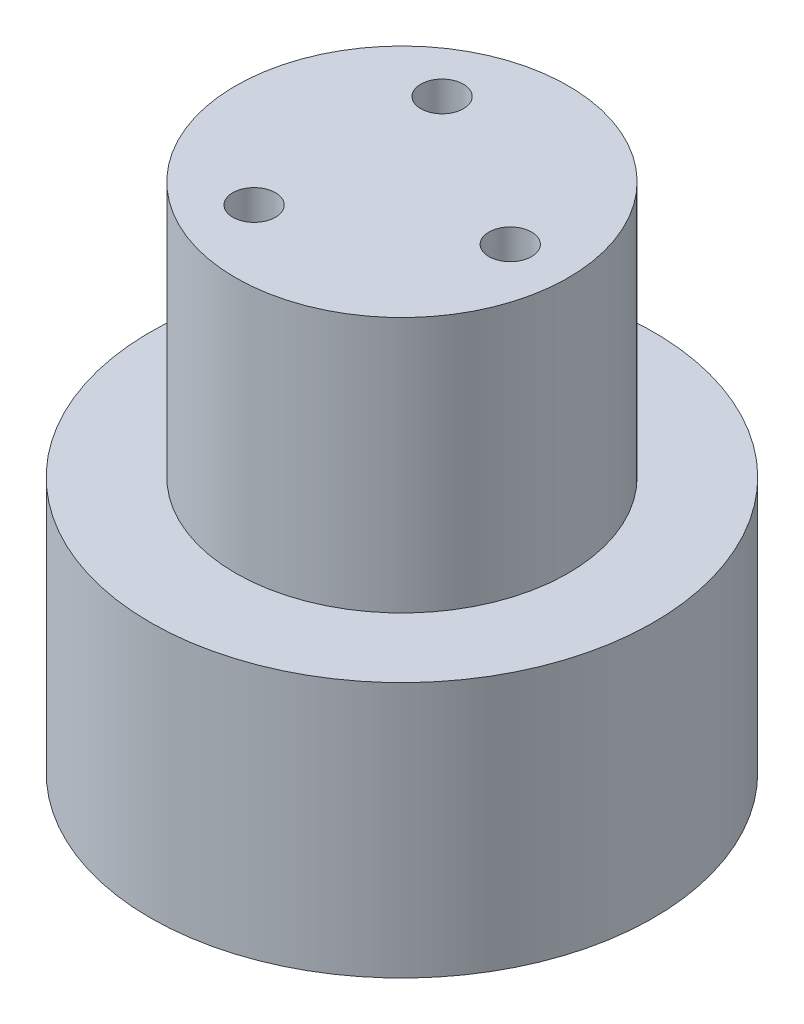
ISO-10303-21;
HEADER;
FILE_DESCRIPTION(('STEP AP214'),'2;1');
FILE_NAME('part.step','',(''),(''),'','','');
FILE_SCHEMA(('AUTOMOTIVE_DESIGN { 1 0 10303 214 1 1 1 1 }'));
ENDSEC;
DATA;
#1=APPLICATION_CONTEXT('core data for automotive mechanical design processes');
#2=APPLICATION_PROTOCOL_DEFINITION('international standard','automotive_design',2000,#1);
#3=PRODUCT_CONTEXT('',#1,'mechanical');
#4=PRODUCT('Part','Part','',(#3));
#5=PRODUCT_RELATED_PRODUCT_CATEGORY('part','',(#4));
#6=PRODUCT_DEFINITION_FORMATION('','',#4);
#7=PRODUCT_DEFINITION_CONTEXT('part definition',#1,'design');
#8=PRODUCT_DEFINITION('design','',#6,#7);
#9=PRODUCT_DEFINITION_SHAPE('','',#8);
#10=(LENGTH_UNIT() NAMED_UNIT(*) SI_UNIT(.MILLI.,.METRE.));
#11=(NAMED_UNIT(*) PLANE_ANGLE_UNIT() SI_UNIT($,.RADIAN.));
#12=(NAMED_UNIT(*) SI_UNIT($,.STERADIAN.) SOLID_ANGLE_UNIT());
#13=UNCERTAINTY_MEASURE_WITH_UNIT(LENGTH_MEASURE(1.E-05),#10,'distance_accuracy_value','');
#14=(GEOMETRIC_REPRESENTATION_CONTEXT(3) GLOBAL_UNCERTAINTY_ASSIGNED_CONTEXT((#13)) GLOBAL_UNIT_ASSIGNED_CONTEXT((#10,
#11,#12)) REPRESENTATION_CONTEXT('',''));
#15=CARTESIAN_POINT('',(0.,0.,0.));
#16=DIRECTION('',(0.,0.,1.));
#17=DIRECTION('',(1.,0.,0.));
#18=AXIS2_PLACEMENT_3D('',#15,#16,#17);
#19=CARTESIAN_POINT('',(0.,-3.,0.));
#20=DIRECTION('',(0.,1.,0.));
#21=DIRECTION('',(0.,0.,1.));
#22=AXIS2_PLACEMENT_3D('',#19,#20,#21);
#23=CYLINDRICAL_SURFACE('',#22,2.95);
#24=CARTESIAN_POINT('',(0.,-3.,0.));
#25=DIRECTION('',(0.,1.,0.));
#26=DIRECTION('',(0.,0.,1.));
#27=AXIS2_PLACEMENT_3D('',#24,#25,#26);
#28=CIRCLE('',#27,2.95);
#29=CARTESIAN_POINT('',(0.,-3.,2.95));
#30=VERTEX_POINT('',#29);
#31=EDGE_CURVE('E40',#30,#30,#28,.T.);
#32=ORIENTED_EDGE('',*,*,#31,.T.);
#33=EDGE_LOOP('',(#32));
#34=FACE_BOUND('',#33,.T.);
#35=CARTESIAN_POINT('',(0.,0.,0.));
#36=DIRECTION('',(0.,1.,0.));
#37=DIRECTION('',(0.,0.,1.));
#38=AXIS2_PLACEMENT_3D('',#35,#36,#37);
#39=CIRCLE('',#38,2.95);
#40=CARTESIAN_POINT('',(0.,0.,2.95));
#41=VERTEX_POINT('',#40);
#42=EDGE_CURVE('E36',#41,#41,#39,.T.);
#43=ORIENTED_EDGE('',*,*,#42,.F.);
#44=EDGE_LOOP('',(#43));
#45=FACE_BOUND('',#44,.T.);
#46=ADVANCED_FACE('F33',(#34,#45),#23,.T.);
#47=CARTESIAN_POINT('',(0.,-3.,0.));
#48=DIRECTION('',(0.,1.,0.));
#49=DIRECTION('',(0.,0.,1.));
#50=AXIS2_PLACEMENT_3D('',#47,#48,#49);
#51=PLANE('',#50);
#52=CARTESIAN_POINT('',(1.27000000000006,-3.,0.));
#53=DIRECTION('',(0.,-1.,0.));
#54=DIRECTION('',(0.,0.,-1.));
#55=AXIS2_PLACEMENT_3D('',#52,#53,#54);
#56=CIRCLE('',#55,0.250000000000013);
#57=CARTESIAN_POINT('',(1.27000000000006,-3.,-0.249999999999999));
#58=VERTEX_POINT('',#57);
#59=EDGE_CURVE('E62',#58,#58,#56,.T.);
#60=ORIENTED_EDGE('',*,*,#59,.F.);
#61=EDGE_LOOP('',(#60));
#62=FACE_BOUND('',#61,.T.);
#63=CARTESIAN_POINT('',(-0.630957819255,-3.,1.10217613398265));
#64=DIRECTION('',(0.,-1.,0.));
#65=DIRECTION('',(0.,0.,-1.));
#66=AXIS2_PLACEMENT_3D('',#63,#64,#65);
#67=CIRCLE('',#66,0.250000000000013);
#68=CARTESIAN_POINT('',(-0.630957819255,-3.,0.852176133982633));
#69=VERTEX_POINT('',#68);
#70=EDGE_CURVE('E56',#69,#69,#67,.T.);
#71=ORIENTED_EDGE('',*,*,#70,.F.);
#72=EDGE_LOOP('',(#71));
#73=FACE_BOUND('',#72,.T.);
#74=CARTESIAN_POINT('',(-0.630957819255001,-3.,-1.10217613398262));
#75=DIRECTION('',(0.,-1.,0.));
#76=DIRECTION('',(0.,0.,-1.));
#77=AXIS2_PLACEMENT_3D('',#74,#75,#76);
#78=CIRCLE('',#77,0.250000000000013);
#79=CARTESIAN_POINT('',(-0.630957819255001,-3.,-1.35217613398263));
#80=VERTEX_POINT('',#79);
#81=EDGE_CURVE('E50',#80,#80,#78,.T.);
#82=ORIENTED_EDGE('',*,*,#81,.F.);
#83=EDGE_LOOP('',(#82));
#84=FACE_BOUND('',#83,.T.);
#85=ORIENTED_EDGE('',*,*,#31,.F.);
#86=EDGE_LOOP('',(#85));
#87=FACE_BOUND('',#86,.T.);
#88=ADVANCED_FACE('F78',(#62,#73,#84,#87),#51,.F.);
#89=CARTESIAN_POINT('',(0.,0.,0.));
#90=DIRECTION('',(0.,1.,0.));
#91=DIRECTION('',(0.,0.,1.));
#92=AXIS2_PLACEMENT_3D('',#89,#90,#91);
#93=PLANE('',#92);
#94=CARTESIAN_POINT('',(0.,0.,0.));
#95=DIRECTION('',(0.,1.,0.));
#96=DIRECTION('',(0.,0.,1.));
#97=AXIS2_PLACEMENT_3D('',#94,#95,#96);
#98=CIRCLE('',#97,1.95);
#99=CARTESIAN_POINT('',(0.,0.,1.95));
#100=VERTEX_POINT('',#99);
#101=EDGE_CURVE('E10',#100,#100,#98,.T.);
#102=ORIENTED_EDGE('',*,*,#101,.F.);
#103=EDGE_LOOP('',(#102));
#104=FACE_BOUND('',#103,.T.);
#105=ORIENTED_EDGE('',*,*,#42,.T.);
#106=EDGE_LOOP('',(#105));
#107=FACE_BOUND('',#106,.T.);
#108=ADVANCED_FACE('F81',(#104,#107),#93,.T.);
#109=CARTESIAN_POINT('',(0.,3.,0.));
#110=DIRECTION('',(0.,-1.,0.));
#111=DIRECTION('',(0.,0.,-1.));
#112=AXIS2_PLACEMENT_3D('',#109,#110,#111);
#113=CYLINDRICAL_SURFACE('',#112,1.95);
#114=CARTESIAN_POINT('',(0.,3.,0.));
#115=DIRECTION('',(0.,1.,0.));
#116=DIRECTION('',(0.,0.,1.));
#117=AXIS2_PLACEMENT_3D('',#114,#115,#116);
#118=CIRCLE('',#117,1.95);
#119=CARTESIAN_POINT('',(0.,3.,1.95));
#120=VERTEX_POINT('',#119);
#121=EDGE_CURVE('E46',#120,#120,#118,.T.);
#122=ORIENTED_EDGE('',*,*,#121,.F.);
#123=EDGE_LOOP('',(#122));
#124=FACE_BOUND('',#123,.T.);
#125=ORIENTED_EDGE('',*,*,#101,.T.);
#126=EDGE_LOOP('',(#125));
#127=FACE_BOUND('',#126,.T.);
#128=ADVANCED_FACE('F95',(#124,#127),#113,.T.);
#129=CARTESIAN_POINT('',(0.,3.,0.));
#130=DIRECTION('',(0.,1.,0.));
#131=DIRECTION('',(0.,0.,1.));
#132=AXIS2_PLACEMENT_3D('',#129,#130,#131);
#133=PLANE('',#132);
#134=CARTESIAN_POINT('',(1.27000000000006,3.,0.));
#135=DIRECTION('',(0.,-1.,0.));
#136=DIRECTION('',(0.,0.,-1.));
#137=AXIS2_PLACEMENT_3D('',#134,#135,#136);
#138=CIRCLE('',#137,0.250000000000013);
#139=CARTESIAN_POINT('',(1.27000000000006,3.,-0.249999999999999));
#140=VERTEX_POINT('',#139);
#141=EDGE_CURVE('E49',#140,#140,#138,.T.);
#142=ORIENTED_EDGE('',*,*,#141,.T.);
#143=EDGE_LOOP('',(#142));
#144=FACE_BOUND('',#143,.T.);
#145=CARTESIAN_POINT('',(-0.630957819255,3.,1.10217613398265));
#146=DIRECTION('',(0.,-1.,0.));
#147=DIRECTION('',(0.,0.,-1.));
#148=AXIS2_PLACEMENT_3D('',#145,#146,#147);
#149=CIRCLE('',#148,0.250000000000013);
#150=CARTESIAN_POINT('',(-0.630957819255,3.,0.852176133982633));
#151=VERTEX_POINT('',#150);
#152=EDGE_CURVE('E59',#151,#151,#149,.T.);
#153=ORIENTED_EDGE('',*,*,#152,.T.);
#154=EDGE_LOOP('',(#153));
#155=FACE_BOUND('',#154,.T.);
#156=CARTESIAN_POINT('',(-0.630957819255001,3.,-1.10217613398262));
#157=DIRECTION('',(0.,-1.,0.));
#158=DIRECTION('',(0.,0.,-1.));
#159=AXIS2_PLACEMENT_3D('',#156,#157,#158);
#160=CIRCLE('',#159,0.250000000000013);
#161=CARTESIAN_POINT('',(-0.630957819255001,3.,-1.35217613398263));
#162=VERTEX_POINT('',#161);
#163=EDGE_CURVE('E53',#162,#162,#160,.T.);
#164=ORIENTED_EDGE('',*,*,#163,.T.);
#165=EDGE_LOOP('',(#164));
#166=FACE_BOUND('',#165,.T.);
#167=ORIENTED_EDGE('',*,*,#121,.T.);
#168=EDGE_LOOP('',(#167));
#169=FACE_BOUND('',#168,.T.);
#170=ADVANCED_FACE('F68',(#144,#155,#166,#169),#133,.T.);
#171=CARTESIAN_POINT('',(-0.630957819255001,3.,-1.10217613398262));
#172=DIRECTION('',(0.,-1.,0.));
#173=DIRECTION('',(0.,0.,-1.));
#174=AXIS2_PLACEMENT_3D('',#171,#172,#173);
#175=CYLINDRICAL_SURFACE('',#174,0.250000000000013);
#176=ORIENTED_EDGE('',*,*,#163,.F.);
#177=EDGE_LOOP('',(#176));
#178=FACE_BOUND('',#177,.T.);
#179=ORIENTED_EDGE('',*,*,#81,.T.);
#180=EDGE_LOOP('',(#179));
#181=FACE_BOUND('',#180,.T.);
#182=ADVANCED_FACE('F106',(#178,#181),#175,.F.);
#183=CARTESIAN_POINT('',(-0.630957819255,3.,1.10217613398265));
#184=DIRECTION('',(0.,-1.,0.));
#185=DIRECTION('',(0.,0.,-1.));
#186=AXIS2_PLACEMENT_3D('',#183,#184,#185);
#187=CYLINDRICAL_SURFACE('',#186,0.250000000000013);
#188=ORIENTED_EDGE('',*,*,#152,.F.);
#189=EDGE_LOOP('',(#188));
#190=FACE_BOUND('',#189,.T.);
#191=ORIENTED_EDGE('',*,*,#70,.T.);
#192=EDGE_LOOP('',(#191));
#193=FACE_BOUND('',#192,.T.);
#194=ADVANCED_FACE('F74',(#190,#193),#187,.F.);
#195=CARTESIAN_POINT('',(1.27000000000006,3.,0.));
#196=DIRECTION('',(0.,-1.,0.));
#197=DIRECTION('',(0.,0.,-1.));
#198=AXIS2_PLACEMENT_3D('',#195,#196,#197);
#199=CYLINDRICAL_SURFACE('',#198,0.250000000000013);
#200=ORIENTED_EDGE('',*,*,#141,.F.);
#201=EDGE_LOOP('',(#200));
#202=FACE_BOUND('',#201,.T.);
#203=ORIENTED_EDGE('',*,*,#59,.T.);
#204=EDGE_LOOP('',(#203));
#205=FACE_BOUND('',#204,.T.);
#206=ADVANCED_FACE('F71',(#202,#205),#199,.F.);
#207=CLOSED_SHELL('',(#46,#88,#108,#128,#170,#182,#194,#206));
#208=MANIFOLD_SOLID_BREP('B2',#207);
#209=ADVANCED_BREP_SHAPE_REPRESENTATION('',(#18,#208),#14);
#210=SHAPE_DEFINITION_REPRESENTATION(#9,#209);
ENDSEC;
END-ISO-10303-21;
